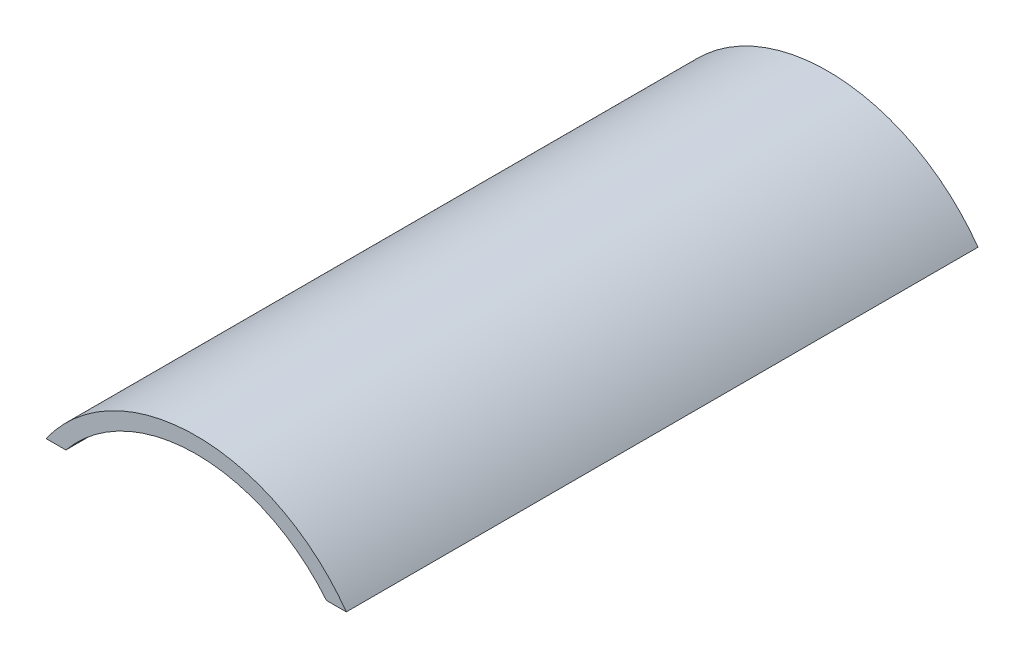
ISO-10303-21;
HEADER;
FILE_DESCRIPTION(('STEP AP214'),'2;1');
FILE_NAME('part.step','',(''),(''),'','','');
FILE_SCHEMA(('AUTOMOTIVE_DESIGN { 1 0 10303 214 1 1 1 1 }'));
ENDSEC;
DATA;
#1=APPLICATION_CONTEXT('core data for automotive mechanical design processes');
#2=APPLICATION_PROTOCOL_DEFINITION('international standard','automotive_design',2000,#1);
#3=PRODUCT_CONTEXT('',#1,'mechanical');
#4=PRODUCT('Part','Part','',(#3));
#5=PRODUCT_RELATED_PRODUCT_CATEGORY('part','',(#4));
#6=PRODUCT_DEFINITION_FORMATION('','',#4);
#7=PRODUCT_DEFINITION_CONTEXT('part definition',#1,'design');
#8=PRODUCT_DEFINITION('design','',#6,#7);
#9=PRODUCT_DEFINITION_SHAPE('','',#8);
#10=(LENGTH_UNIT() NAMED_UNIT(*) SI_UNIT(.MILLI.,.METRE.));
#11=(NAMED_UNIT(*) PLANE_ANGLE_UNIT() SI_UNIT($,.RADIAN.));
#12=(NAMED_UNIT(*) SI_UNIT($,.STERADIAN.) SOLID_ANGLE_UNIT());
#13=UNCERTAINTY_MEASURE_WITH_UNIT(LENGTH_MEASURE(1.E-05),#10,'distance_accuracy_value','');
#14=(GEOMETRIC_REPRESENTATION_CONTEXT(3) GLOBAL_UNCERTAINTY_ASSIGNED_CONTEXT((#13)) GLOBAL_UNIT_ASSIGNED_CONTEXT((#10,
#11,#12)) REPRESENTATION_CONTEXT('',''));
#15=CARTESIAN_POINT('',(0.,0.,0.));
#16=DIRECTION('',(0.,0.,1.));
#17=DIRECTION('',(1.,0.,0.));
#18=AXIS2_PLACEMENT_3D('',#15,#16,#17);
#19=CARTESIAN_POINT('',(12.3765202154213,10.140105884914,60.));
#20=DIRECTION('',(0.,1.,0.));
#21=DIRECTION('',(0.,0.,1.));
#22=AXIS2_PLACEMENT_3D('',#19,#20,#21);
#23=PLANE('',#22);
#24=DIRECTION('',(1.,0.,0.));
#25=VECTOR('',#24,1.);
#26=CARTESIAN_POINT('',(12.3765202154213,10.140105884914,0.));
#27=LINE('',#26,#25);
#28=CARTESIAN_POINT('',(12.3765202154213,10.140105884914,0.));
#29=VERTEX_POINT('',#28);
#30=CARTESIAN_POINT('',(14.2628276524234,10.140105884914,0.));
#31=VERTEX_POINT('',#30);
#32=EDGE_CURVE('E109',#29,#31,#27,.T.);
#33=ORIENTED_EDGE('',*,*,#32,.T.);
#34=DIRECTION('',(0.,0.,-1.));
#35=VECTOR('',#34,1.);
#36=CARTESIAN_POINT('',(14.2628276524234,10.140105884914,60.));
#37=LINE('',#36,#35);
#38=CARTESIAN_POINT('',(14.2628276524234,10.140105884914,60.));
#39=VERTEX_POINT('',#38);
#40=EDGE_CURVE('E11',#39,#31,#37,.T.);
#41=ORIENTED_EDGE('',*,*,#40,.F.);
#42=DIRECTION('',(1.,0.,0.));
#43=VECTOR('',#42,1.);
#44=CARTESIAN_POINT('',(12.3765202154213,10.140105884914,60.));
#45=LINE('',#44,#43);
#46=CARTESIAN_POINT('',(12.3765202154213,10.140105884914,60.));
#47=VERTEX_POINT('',#46);
#48=EDGE_CURVE('E91',#47,#39,#45,.T.);
#49=ORIENTED_EDGE('',*,*,#48,.F.);
#50=DIRECTION('',(0.,0.,-1.));
#51=VECTOR('',#50,1.);
#52=CARTESIAN_POINT('',(12.3765202154213,10.140105884914,60.));
#53=LINE('',#52,#51);
#54=EDGE_CURVE('E58',#47,#29,#53,.T.);
#55=ORIENTED_EDGE('',*,*,#54,.T.);
#56=EDGE_LOOP('',(#33,#41,#49,#55));
#57=FACE_BOUND('',#56,.T.);
#58=ADVANCED_FACE('F41',(#57),#23,.F.);
#59=CARTESIAN_POINT('',(0.,0.,60.));
#60=DIRECTION('',(0.,0.,-1.));
#61=DIRECTION('',(-1.,0.,0.));
#62=AXIS2_PLACEMENT_3D('',#59,#60,#61);
#63=CYLINDRICAL_SURFACE('',#62,17.5);
#64=CARTESIAN_POINT('',(0.,0.,0.));
#65=DIRECTION('',(0.,0.,1.));
#66=DIRECTION('',(1.,0.,0.));
#67=AXIS2_PLACEMENT_3D('',#64,#65,#66);
#68=CIRCLE('',#67,17.5);
#69=CARTESIAN_POINT('',(-14.2628276524234,10.140105884914,0.));
#70=VERTEX_POINT('',#69);
#71=EDGE_CURVE('E97',#31,#70,#68,.T.);
#72=ORIENTED_EDGE('',*,*,#71,.T.);
#73=DIRECTION('',(0.,0.,-1.));
#74=VECTOR('',#73,1.);
#75=CARTESIAN_POINT('',(-14.2628276524234,10.140105884914,60.));
#76=LINE('',#75,#74);
#77=CARTESIAN_POINT('',(-14.2628276524234,10.140105884914,60.));
#78=VERTEX_POINT('',#77);
#79=EDGE_CURVE('E50',#78,#70,#76,.T.);
#80=ORIENTED_EDGE('',*,*,#79,.F.);
#81=CARTESIAN_POINT('',(0.,0.,60.));
#82=DIRECTION('',(0.,0.,1.));
#83=DIRECTION('',(1.,0.,0.));
#84=AXIS2_PLACEMENT_3D('',#81,#82,#83);
#85=CIRCLE('',#84,17.5);
#86=EDGE_CURVE('E83',#39,#78,#85,.T.);
#87=ORIENTED_EDGE('',*,*,#86,.F.);
#88=ORIENTED_EDGE('',*,*,#40,.T.);
#89=EDGE_LOOP('',(#72,#80,#87,#88));
#90=FACE_BOUND('',#89,.T.);
#91=ADVANCED_FACE('F96',(#90),#63,.T.);
#92=CARTESIAN_POINT('',(-12.3765202154213,10.140105884914,60.));
#93=DIRECTION('',(0.,-1.,0.));
#94=DIRECTION('',(0.,0.,-1.));
#95=AXIS2_PLACEMENT_3D('',#92,#93,#94);
#96=PLANE('',#95);
#97=DIRECTION('',(-1.,0.,0.));
#98=VECTOR('',#97,1.);
#99=CARTESIAN_POINT('',(-12.3765202154213,10.140105884914,0.));
#100=LINE('',#99,#98);
#101=CARTESIAN_POINT('',(-12.3765202154213,10.140105884914,0.));
#102=VERTEX_POINT('',#101);
#103=EDGE_CURVE('E114',#102,#70,#100,.T.);
#104=ORIENTED_EDGE('',*,*,#103,.F.);
#105=DIRECTION('',(0.,0.,-1.));
#106=VECTOR('',#105,1.);
#107=CARTESIAN_POINT('',(-12.3765202154213,10.140105884914,60.));
#108=LINE('',#107,#106);
#109=CARTESIAN_POINT('',(-12.3765202154213,10.140105884914,60.));
#110=VERTEX_POINT('',#109);
#111=EDGE_CURVE('E72',#110,#102,#108,.T.);
#112=ORIENTED_EDGE('',*,*,#111,.F.);
#113=DIRECTION('',(-1.,0.,0.));
#114=VECTOR('',#113,1.);
#115=CARTESIAN_POINT('',(-12.3765202154213,10.140105884914,60.));
#116=LINE('',#115,#114);
#117=EDGE_CURVE('E90',#110,#78,#116,.T.);
#118=ORIENTED_EDGE('',*,*,#117,.T.);
#119=ORIENTED_EDGE('',*,*,#79,.T.);
#120=EDGE_LOOP('',(#104,#112,#118,#119));
#121=FACE_BOUND('',#120,.T.);
#122=ADVANCED_FACE('F101',(#121),#96,.T.);
#123=CARTESIAN_POINT('',(0.,0.,60.));
#124=DIRECTION('',(0.,0.,-1.));
#125=DIRECTION('',(-1.,0.,0.));
#126=AXIS2_PLACEMENT_3D('',#123,#124,#125);
#127=CYLINDRICAL_SURFACE('',#126,16.);
#128=CARTESIAN_POINT('',(0.,0.,0.));
#129=DIRECTION('',(0.,0.,1.));
#130=DIRECTION('',(1.,0.,0.));
#131=AXIS2_PLACEMENT_3D('',#128,#129,#130);
#132=CIRCLE('',#131,16.);
#133=EDGE_CURVE('E117',#29,#102,#132,.T.);
#134=ORIENTED_EDGE('',*,*,#133,.F.);
#135=ORIENTED_EDGE('',*,*,#54,.F.);
#136=CARTESIAN_POINT('',(0.,0.,60.));
#137=DIRECTION('',(0.,0.,1.));
#138=DIRECTION('',(1.,0.,0.));
#139=AXIS2_PLACEMENT_3D('',#136,#137,#138);
#140=CIRCLE('',#139,16.);
#141=EDGE_CURVE('E103',#47,#110,#140,.T.);
#142=ORIENTED_EDGE('',*,*,#141,.T.);
#143=ORIENTED_EDGE('',*,*,#111,.T.);
#144=EDGE_LOOP('',(#134,#135,#142,#143));
#145=FACE_BOUND('',#144,.T.);
#146=ADVANCED_FACE('F127',(#145),#127,.F.);
#147=CARTESIAN_POINT('',(0.,0.,60.));
#148=DIRECTION('',(0.,0.,1.));
#149=DIRECTION('',(1.,0.,0.));
#150=AXIS2_PLACEMENT_3D('',#147,#148,#149);
#151=PLANE('',#150);
#152=ORIENTED_EDGE('',*,*,#48,.T.);
#153=ORIENTED_EDGE('',*,*,#86,.T.);
#154=ORIENTED_EDGE('',*,*,#117,.F.);
#155=ORIENTED_EDGE('',*,*,#141,.F.);
#156=EDGE_LOOP('',(#152,#153,#154,#155));
#157=FACE_BOUND('',#156,.T.);
#158=ADVANCED_FACE('F87',(#157),#151,.T.);
#159=CARTESIAN_POINT('',(0.,0.,0.));
#160=DIRECTION('',(0.,0.,1.));
#161=DIRECTION('',(1.,0.,0.));
#162=AXIS2_PLACEMENT_3D('',#159,#160,#161);
#163=PLANE('',#162);
#164=ORIENTED_EDGE('',*,*,#32,.F.);
#165=ORIENTED_EDGE('',*,*,#133,.T.);
#166=ORIENTED_EDGE('',*,*,#103,.T.);
#167=ORIENTED_EDGE('',*,*,#71,.F.);
#168=EDGE_LOOP('',(#164,#165,#166,#167));
#169=FACE_BOUND('',#168,.T.);
#170=ADVANCED_FACE('F126',(#169),#163,.F.);
#171=CLOSED_SHELL('',(#58,#91,#122,#146,#158,#170));
#172=MANIFOLD_SOLID_BREP('B2',#171);
#173=ADVANCED_BREP_SHAPE_REPRESENTATION('',(#18,#172),#14);
#174=SHAPE_DEFINITION_REPRESENTATION(#9,#173);
ENDSEC;
END-ISO-10303-21;
